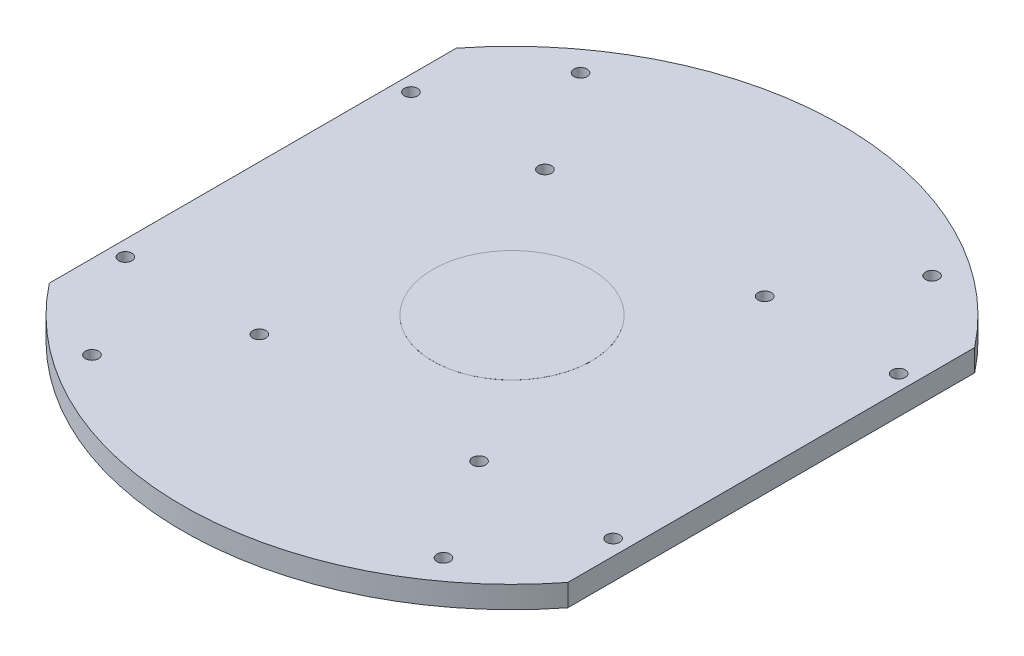
ISO-10303-21;
HEADER;
FILE_DESCRIPTION(('STEP AP214'),'2;1');
FILE_NAME('part.step','',(''),(''),'','','');
FILE_SCHEMA(('AUTOMOTIVE_DESIGN { 1 0 10303 214 1 1 1 1 }'));
ENDSEC;
DATA;
#1=APPLICATION_CONTEXT('core data for automotive mechanical design processes');
#2=APPLICATION_PROTOCOL_DEFINITION('international standard','automotive_design',2000,#1);
#3=PRODUCT_CONTEXT('',#1,'mechanical');
#4=PRODUCT('Part','Part','',(#3));
#5=PRODUCT_RELATED_PRODUCT_CATEGORY('part','',(#4));
#6=PRODUCT_DEFINITION_FORMATION('','',#4);
#7=PRODUCT_DEFINITION_CONTEXT('part definition',#1,'design');
#8=PRODUCT_DEFINITION('design','',#6,#7);
#9=PRODUCT_DEFINITION_SHAPE('','',#8);
#10=(LENGTH_UNIT() NAMED_UNIT(*) SI_UNIT(.MILLI.,.METRE.));
#11=(NAMED_UNIT(*) PLANE_ANGLE_UNIT() SI_UNIT($,.RADIAN.));
#12=(NAMED_UNIT(*) SI_UNIT($,.STERADIAN.) SOLID_ANGLE_UNIT());
#13=UNCERTAINTY_MEASURE_WITH_UNIT(LENGTH_MEASURE(1.E-05),#10,'distance_accuracy_value','');
#14=(GEOMETRIC_REPRESENTATION_CONTEXT(3) GLOBAL_UNCERTAINTY_ASSIGNED_CONTEXT((#13)) GLOBAL_UNIT_ASSIGNED_CONTEXT((#10,
#11,#12)) REPRESENTATION_CONTEXT('',''));
#15=CARTESIAN_POINT('',(0.,0.,0.));
#16=DIRECTION('',(0.,0.,1.));
#17=DIRECTION('',(1.,0.,0.));
#18=AXIS2_PLACEMENT_3D('',#15,#16,#17);
#19=CARTESIAN_POINT('',(0.,5.01,0.));
#20=DIRECTION('',(0.,-1.,0.));
#21=DIRECTION('',(0.,0.,-1.));
#22=AXIS2_PLACEMENT_3D('',#19,#20,#21);
#23=CYLINDRICAL_SURFACE('',#22,18.0557843472479);
#24=CARTESIAN_POINT('',(0.,5.01,0.));
#25=DIRECTION('',(0.,1.,0.));
#26=DIRECTION('',(0.,0.,1.));
#27=AXIS2_PLACEMENT_3D('',#24,#25,#26);
#28=CIRCLE('',#27,18.0557843472479);
#29=CARTESIAN_POINT('',(0.,5.01,-18.0557843472479));
#30=VERTEX_POINT('',#29);
#31=EDGE_CURVE('E11',#30,#30,#28,.T.);
#32=CARTESIAN_POINT('',(0.,5.,0.));
#33=DIRECTION('',(0.,1.,0.));
#34=DIRECTION('',(0.,0.,1.));
#35=AXIS2_PLACEMENT_3D('',#32,#33,#34);
#36=CIRCLE('',#35,18.0557843472479);
#37=CARTESIAN_POINT('',(0.,5.,-18.0557843472479));
#38=VERTEX_POINT('',#37);
#39=EDGE_CURVE('E52',#38,#38,#36,.T.);
#40=CARTESIAN_POINT('',(0.,5.01,-18.0557843472479));
#41=CARTESIAN_POINT('',(0.,5.00989583333333,-18.0557843472479));
#42=CARTESIAN_POINT('',(0.,5.00979166666667,-18.0557843472479));
#43=CARTESIAN_POINT('',(0.,5.00958333333333,-18.0557843472479));
#44=CARTESIAN_POINT('',(0.,5.00947916666667,-18.0557843472479));
#45=CARTESIAN_POINT('',(0.,5.00927083333333,-18.0557843472479));
#46=CARTESIAN_POINT('',(0.,5.00916666666667,-18.0557843472479));
#47=CARTESIAN_POINT('',(0.,5.00895833333333,-18.0557843472479));
#48=CARTESIAN_POINT('',(0.,5.00885416666667,-18.0557843472479));
#49=CARTESIAN_POINT('',(0.,5.00864583333333,-18.0557843472479));
#50=CARTESIAN_POINT('',(0.,5.00854166666667,-18.0557843472479));
#51=CARTESIAN_POINT('',(0.,5.00833333333333,-18.0557843472479));
#52=CARTESIAN_POINT('',(0.,5.00822916666667,-18.0557843472479));
#53=CARTESIAN_POINT('',(0.,5.00802083333333,-18.0557843472479));
#54=CARTESIAN_POINT('',(0.,5.00791666666667,-18.0557843472479));
#55=CARTESIAN_POINT('',(0.,5.00770833333333,-18.0557843472479));
#56=CARTESIAN_POINT('',(0.,5.00760416666667,-18.0557843472479));
#57=CARTESIAN_POINT('',(0.,5.00739583333333,-18.0557843472479));
#58=CARTESIAN_POINT('',(0.,5.00729166666667,-18.0557843472479));
#59=CARTESIAN_POINT('',(0.,5.00708333333333,-18.0557843472479));
#60=CARTESIAN_POINT('',(0.,5.00697916666667,-18.0557843472479));
#61=CARTESIAN_POINT('',(0.,5.00677083333333,-18.0557843472479));
#62=CARTESIAN_POINT('',(0.,5.00666666666667,-18.0557843472479));
#63=CARTESIAN_POINT('',(0.,5.00645833333333,-18.0557843472479));
#64=CARTESIAN_POINT('',(0.,5.00635416666667,-18.0557843472479));
#65=CARTESIAN_POINT('',(0.,5.00614583333333,-18.0557843472479));
#66=CARTESIAN_POINT('',(0.,5.00604166666667,-18.0557843472479));
#67=CARTESIAN_POINT('',(0.,5.00583333333333,-18.0557843472479));
#68=CARTESIAN_POINT('',(0.,5.00572916666667,-18.0557843472479));
#69=CARTESIAN_POINT('',(0.,5.00552083333333,-18.0557843472479));
#70=CARTESIAN_POINT('',(0.,5.00541666666667,-18.0557843472479));
#71=CARTESIAN_POINT('',(0.,5.00520833333333,-18.0557843472479));
#72=CARTESIAN_POINT('',(0.,5.00510416666667,-18.0557843472479));
#73=CARTESIAN_POINT('',(0.,5.00489583333333,-18.0557843472479));
#74=CARTESIAN_POINT('',(0.,5.00479166666667,-18.0557843472479));
#75=CARTESIAN_POINT('',(0.,5.00458333333333,-18.0557843472479));
#76=CARTESIAN_POINT('',(0.,5.00447916666667,-18.0557843472479));
#77=CARTESIAN_POINT('',(0.,5.00427083333333,-18.0557843472479));
#78=CARTESIAN_POINT('',(0.,5.00416666666667,-18.0557843472479));
#79=CARTESIAN_POINT('',(0.,5.00395833333333,-18.0557843472479));
#80=CARTESIAN_POINT('',(0.,5.00385416666667,-18.0557843472479));
#81=CARTESIAN_POINT('',(0.,5.00364583333333,-18.0557843472479));
#82=CARTESIAN_POINT('',(0.,5.00354166666667,-18.0557843472479));
#83=CARTESIAN_POINT('',(0.,5.00333333333333,-18.0557843472479));
#84=CARTESIAN_POINT('',(0.,5.00322916666667,-18.0557843472479));
#85=CARTESIAN_POINT('',(0.,5.00302083333333,-18.0557843472479));
#86=CARTESIAN_POINT('',(0.,5.00291666666667,-18.0557843472479));
#87=CARTESIAN_POINT('',(0.,5.00270833333333,-18.0557843472479));
#88=CARTESIAN_POINT('',(0.,5.00260416666667,-18.0557843472479));
#89=CARTESIAN_POINT('',(0.,5.00239583333333,-18.0557843472479));
#90=CARTESIAN_POINT('',(0.,5.00229166666667,-18.0557843472479));
#91=CARTESIAN_POINT('',(0.,5.00208333333333,-18.0557843472479));
#92=CARTESIAN_POINT('',(0.,5.00197916666667,-18.0557843472479));
#93=CARTESIAN_POINT('',(0.,5.00177083333333,-18.0557843472479));
#94=CARTESIAN_POINT('',(0.,5.00166666666667,-18.0557843472479));
#95=CARTESIAN_POINT('',(0.,5.00145833333333,-18.0557843472479));
#96=CARTESIAN_POINT('',(0.,5.00135416666667,-18.0557843472479));
#97=CARTESIAN_POINT('',(0.,5.00114583333333,-18.0557843472479));
#98=CARTESIAN_POINT('',(0.,5.00104166666667,-18.0557843472479));
#99=CARTESIAN_POINT('',(0.,5.00083333333333,-18.0557843472479));
#100=CARTESIAN_POINT('',(0.,5.00072916666667,-18.0557843472479));
#101=CARTESIAN_POINT('',(0.,5.00052083333333,-18.0557843472479));
#102=CARTESIAN_POINT('',(0.,5.00041666666667,-18.0557843472479));
#103=CARTESIAN_POINT('',(0.,5.00020833333333,-18.0557843472479));
#104=CARTESIAN_POINT('',(0.,5.00010416666667,-18.0557843472479));
#105=CARTESIAN_POINT('',(0.,5.,-18.0557843472479));
#106=B_SPLINE_CURVE_WITH_KNOTS('',3,(#40,#41,#42,#43,#44,#45,#46,#47,#48,#49,#50,#51,#52,#53,
#54,#55,#56,#57,#58,#59,#60,#61,#62,#63,#64,#65,#66,#67,#68,#69,#70,#71,#72,#73,#74,#75,#76,#77,
#78,#79,#80,#81,#82,#83,#84,#85,#86,#87,#88,#89,#90,#91,#92,#93,#94,#95,#96,#97,#98,#99,#100,
#101,#102,#103,#104,#105),.UNSPECIFIED.,.F.,.F.,(4,2,2,2,2,2,2,2,2,2,2,2,2,2,2,2,2,2,2,2,2,2,2,
2,2,2,2,2,2,2,2,2,4),(0.,0.000312499999999445,0.000624999999999758,0.000937499999999203,
0.00124999999999952,0.00156249999999983,0.00187499999999927,0.00218749999999959,
0.00249999999999903,0.00281249999999934,0.00312499999999966,0.0034374999999991,
0.00374999999999941,0.00406249999999973,0.00437499999999917,0.00468749999999948,
0.00499999999999893,0.00531249999999924,0.00562499999999955,0.005937499999999,
0.00624999999999931,0.00656249999999962,0.00687499999999907,0.00718749999999938,
0.00749999999999883,0.00781249999999914,0.00812499999999945,0.0084374999999989,
0.00874999999999921,0.00906249999999952,0.00937499999999897,0.00968749999999928,
0.00999999999999873),.UNSPECIFIED.);
#107=EDGE_CURVE('BSEAM49',#30,#38,#106,.T.);
#108=ORIENTED_EDGE('',*,*,#31,.F.);
#109=ORIENTED_EDGE('',*,*,#39,.T.);
#110=ORIENTED_EDGE('',*,*,#107,.T.);
#111=ORIENTED_EDGE('',*,*,#107,.F.);
#112=EDGE_LOOP('',(#108,#110,#109,#111));
#113=FACE_BOUND('',#112,.T.);
#114=ADVANCED_FACE('F49',(#113),#23,.T.);
#115=CARTESIAN_POINT('',(0.,5.01,0.));
#116=DIRECTION('',(0.,1.,0.));
#117=DIRECTION('',(0.,0.,1.));
#118=AXIS2_PLACEMENT_3D('',#115,#116,#117);
#119=PLANE('',#118);
#120=ORIENTED_EDGE('',*,*,#31,.T.);
#121=EDGE_LOOP('',(#120));
#122=FACE_BOUND('',#121,.T.);
#123=ADVANCED_FACE('F64',(#122),#119,.T.);
#124=CARTESIAN_POINT('',(0.,5.,0.));
#125=DIRECTION('',(0.,1.,0.));
#126=DIRECTION('',(0.,0.,1.));
#127=AXIS2_PLACEMENT_3D('',#124,#125,#126);
#128=PLANE('',#127);
#129=ORIENTED_EDGE('',*,*,#39,.F.);
#130=EDGE_LOOP('',(#129));
#131=FACE_BOUND('',#130,.T.);
#132=ADVANCED_FACE('F62',(#131),#128,.F.);
#133=CLOSED_SHELL('',(#114,#123,#132));
#134=MANIFOLD_SOLID_BREP('B2',#133);
#135=CARTESIAN_POINT('',(0.,5.,0.));
#136=DIRECTION('',(0.,-1.,0.));
#137=DIRECTION('',(0.,0.,-1.));
#138=AXIS2_PLACEMENT_3D('',#135,#136,#137);
#139=CYLINDRICAL_SURFACE('',#138,75.);
#140=CARTESIAN_POINT('',(0.,5.,0.));
#141=DIRECTION('',(0.,1.,0.));
#142=DIRECTION('',(0.,0.,1.));
#143=AXIS2_PLACEMENT_3D('',#140,#141,#142);
#144=CIRCLE('',#143,75.);
#145=CARTESIAN_POINT('',(-59.,5.,46.303347611161));
#146=VERTEX_POINT('',#145);
#147=CARTESIAN_POINT('',(59.,5.,46.303347611161));
#148=VERTEX_POINT('',#147);
#149=EDGE_CURVE('E143',#146,#148,#144,.T.);
#150=ORIENTED_EDGE('',*,*,#149,.F.);
#151=DIRECTION('',(0.,1.,0.));
#152=VECTOR('',#151,1.);
#153=CARTESIAN_POINT('',(-59.,-5.,46.303347611161));
#154=LINE('',#153,#152);
#155=CARTESIAN_POINT('',(-59.,0.,46.303347611161));
#156=VERTEX_POINT('',#155);
#157=EDGE_CURVE('E128',#156,#146,#154,.T.);
#158=ORIENTED_EDGE('',*,*,#157,.F.);
#159=CARTESIAN_POINT('',(0.,0.,0.));
#160=DIRECTION('',(0.,1.,0.));
#161=DIRECTION('',(0.,0.,1.));
#162=AXIS2_PLACEMENT_3D('',#159,#160,#161);
#163=CIRCLE('',#162,75.);
#164=CARTESIAN_POINT('',(59.,0.,46.3033476111609));
#165=VERTEX_POINT('',#164);
#166=EDGE_CURVE('E150',#156,#165,#163,.T.);
#167=ORIENTED_EDGE('',*,*,#166,.T.);
#168=DIRECTION('',(0.,1.,0.));
#169=VECTOR('',#168,1.);
#170=CARTESIAN_POINT('',(59.,-5.,46.303347611161));
#171=LINE('',#170,#169);
#172=EDGE_CURVE('E112',#165,#148,#171,.T.);
#173=ORIENTED_EDGE('',*,*,#172,.T.);
#174=EDGE_LOOP('',(#150,#158,#167,#173));
#175=FACE_BOUND('',#174,.T.);
#176=ADVANCED_FACE('F90',(#175),#139,.T.);
#177=CARTESIAN_POINT('',(59.,0.,-46.3033476111609));
#178=VERTEX_POINT('',#177);
#179=CARTESIAN_POINT('',(-59.,0.,-46.3033476111609));
#180=VERTEX_POINT('',#179);
#181=EDGE_CURVE('E147',#178,#180,#163,.T.);
#182=ORIENTED_EDGE('',*,*,#181,.T.);
#183=DIRECTION('',(0.,1.,0.));
#184=VECTOR('',#183,1.);
#185=CARTESIAN_POINT('',(-59.,-5.,-46.3033476111609));
#186=LINE('',#185,#184);
#187=CARTESIAN_POINT('',(-59.,5.,-46.3033476111609));
#188=VERTEX_POINT('',#187);
#189=EDGE_CURVE('E105',#180,#188,#186,.T.);
#190=ORIENTED_EDGE('',*,*,#189,.T.);
#191=CARTESIAN_POINT('',(59.,5.,-46.3033476111609));
#192=VERTEX_POINT('',#191);
#193=EDGE_CURVE('E145',#192,#188,#144,.T.);
#194=ORIENTED_EDGE('',*,*,#193,.F.);
#195=DIRECTION('',(0.,1.,0.));
#196=VECTOR('',#195,1.);
#197=CARTESIAN_POINT('',(59.,-5.,-46.3033476111609));
#198=LINE('',#197,#196);
#199=EDGE_CURVE('E161',#178,#192,#198,.T.);
#200=ORIENTED_EDGE('',*,*,#199,.F.);
#201=EDGE_LOOP('',(#182,#190,#194,#200));
#202=FACE_BOUND('',#201,.T.);
#203=ADVANCED_FACE('F92',(#202),#139,.T.);
#204=CARTESIAN_POINT('',(0.,5.,0.));
#205=DIRECTION('',(0.,1.,0.));
#206=DIRECTION('',(0.,0.,1.));
#207=AXIS2_PLACEMENT_3D('',#204,#205,#206);
#208=PLANE('',#207);
#209=DIRECTION('',(0.,0.,-1.));
#210=VECTOR('',#209,1.);
#211=CARTESIAN_POINT('',(-59.,5.,-46.3033476111609));
#212=LINE('',#211,#210);
#213=EDGE_CURVE('E131',#146,#188,#212,.T.);
#214=ORIENTED_EDGE('',*,*,#213,.F.);
#215=ORIENTED_EDGE('',*,*,#149,.T.);
#216=DIRECTION('',(0.,0.,1.));
#217=VECTOR('',#216,1.);
#218=CARTESIAN_POINT('',(59.,5.,-46.3033476111609));
#219=LINE('',#218,#217);
#220=EDGE_CURVE('E163',#192,#148,#219,.T.);
#221=ORIENTED_EDGE('',*,*,#220,.F.);
#222=ORIENTED_EDGE('',*,*,#193,.T.);
#223=EDGE_LOOP('',(#214,#215,#221,#222));
#224=FACE_BOUND('',#223,.T.);
#225=CARTESIAN_POINT('',(55.5,5.,32.5));
#226=DIRECTION('',(0.,1.,0.));
#227=DIRECTION('',(0.,0.,-1.));
#228=AXIS2_PLACEMENT_3D('',#225,#226,#227);
#229=CIRCLE('',#228,1.5);
#230=CARTESIAN_POINT('',(55.5,5.,31.));
#231=VERTEX_POINT('',#230);
#232=EDGE_CURVE('E171',#231,#231,#229,.T.);
#233=ORIENTED_EDGE('',*,*,#232,.F.);
#234=EDGE_LOOP('',(#233));
#235=FACE_BOUND('',#234,.T.);
#236=CARTESIAN_POINT('',(-25.,5.,32.5));
#237=DIRECTION('',(0.,1.,0.));
#238=DIRECTION('',(0.,0.,1.));
#239=AXIS2_PLACEMENT_3D('',#236,#237,#238);
#240=CIRCLE('',#239,1.5);
#241=CARTESIAN_POINT('',(-25.,5.,34.));
#242=VERTEX_POINT('',#241);
#243=EDGE_CURVE('E191',#242,#242,#240,.T.);
#244=ORIENTED_EDGE('',*,*,#243,.F.);
#245=EDGE_LOOP('',(#244));
#246=FACE_BOUND('',#245,.T.);
#247=CARTESIAN_POINT('',(-55.5,5.,32.5));
#248=DIRECTION('',(0.,1.,0.));
#249=DIRECTION('',(0.,0.,1.));
#250=AXIS2_PLACEMENT_3D('',#247,#248,#249);
#251=CIRCLE('',#250,1.5);
#252=CARTESIAN_POINT('',(-55.5,5.,34.));
#253=VERTEX_POINT('',#252);
#254=EDGE_CURVE('E190',#253,#253,#251,.T.);
#255=ORIENTED_EDGE('',*,*,#254,.F.);
#256=EDGE_LOOP('',(#255));
#257=FACE_BOUND('',#256,.T.);
#258=CARTESIAN_POINT('',(-25.,5.,-32.5));
#259=DIRECTION('',(0.,1.,0.));
#260=DIRECTION('',(0.,0.,1.));
#261=AXIS2_PLACEMENT_3D('',#258,#259,#260);
#262=CIRCLE('',#261,1.5);
#263=CARTESIAN_POINT('',(-25.,5.,-31.));
#264=VERTEX_POINT('',#263);
#265=EDGE_CURVE('E203',#264,#264,#262,.T.);
#266=ORIENTED_EDGE('',*,*,#265,.F.);
#267=EDGE_LOOP('',(#266));
#268=FACE_BOUND('',#267,.T.);
#269=CARTESIAN_POINT('',(25.,5.,32.5));
#270=DIRECTION('',(0.,1.,0.));
#271=DIRECTION('',(0.,0.,-1.));
#272=AXIS2_PLACEMENT_3D('',#269,#270,#271);
#273=CIRCLE('',#272,1.5);
#274=CARTESIAN_POINT('',(25.,5.,31.));
#275=VERTEX_POINT('',#274);
#276=EDGE_CURVE('E172',#275,#275,#273,.T.);
#277=ORIENTED_EDGE('',*,*,#276,.F.);
#278=EDGE_LOOP('',(#277));
#279=FACE_BOUND('',#278,.T.);
#280=CARTESIAN_POINT('',(25.,5.,-32.5));
#281=DIRECTION('',(0.,1.,0.));
#282=DIRECTION('',(0.,0.,-1.));
#283=AXIS2_PLACEMENT_3D('',#280,#281,#282);
#284=CIRCLE('',#283,1.5);
#285=CARTESIAN_POINT('',(25.,5.,-34.));
#286=VERTEX_POINT('',#285);
#287=EDGE_CURVE('E178',#286,#286,#284,.T.);
#288=ORIENTED_EDGE('',*,*,#287,.F.);
#289=EDGE_LOOP('',(#288));
#290=FACE_BOUND('',#289,.T.);
#291=CARTESIAN_POINT('',(55.5,5.,-32.5));
#292=DIRECTION('',(0.,1.,0.));
#293=DIRECTION('',(0.,0.,-1.));
#294=AXIS2_PLACEMENT_3D('',#291,#292,#293);
#295=CIRCLE('',#294,1.5);
#296=CARTESIAN_POINT('',(55.5,5.,-34.));
#297=VERTEX_POINT('',#296);
#298=EDGE_CURVE('E184',#297,#297,#295,.T.);
#299=ORIENTED_EDGE('',*,*,#298,.F.);
#300=EDGE_LOOP('',(#299));
#301=FACE_BOUND('',#300,.T.);
#302=CARTESIAN_POINT('',(-55.5,5.,-32.5));
#303=DIRECTION('',(0.,1.,0.));
#304=DIRECTION('',(0.,0.,1.));
#305=AXIS2_PLACEMENT_3D('',#302,#303,#304);
#306=CIRCLE('',#305,1.5);
#307=CARTESIAN_POINT('',(-55.5,5.,-31.));
#308=VERTEX_POINT('',#307);
#309=EDGE_CURVE('E202',#308,#308,#306,.T.);
#310=ORIENTED_EDGE('',*,*,#309,.F.);
#311=EDGE_LOOP('',(#310));
#312=FACE_BOUND('',#311,.T.);
#313=CARTESIAN_POINT('',(-40.,5.,55.6));
#314=DIRECTION('',(0.,1.,0.));
#315=DIRECTION('',(0.,0.,-1.));
#316=AXIS2_PLACEMENT_3D('',#313,#314,#315);
#317=CIRCLE('',#316,1.50000000000001);
#318=CARTESIAN_POINT('',(-40.,5.,54.1));
#319=VERTEX_POINT('',#318);
#320=EDGE_CURVE('E214',#319,#319,#317,.T.);
#321=ORIENTED_EDGE('',*,*,#320,.F.);
#322=EDGE_LOOP('',(#321));
#323=FACE_BOUND('',#322,.T.);
#324=CARTESIAN_POINT('',(40.,5.,55.6));
#325=DIRECTION('',(0.,1.,0.));
#326=DIRECTION('',(0.,0.,1.));
#327=AXIS2_PLACEMENT_3D('',#324,#325,#326);
#328=CIRCLE('',#327,1.49999999999992);
#329=CARTESIAN_POINT('',(40.,5.,57.0999999999999));
#330=VERTEX_POINT('',#329);
#331=EDGE_CURVE('E226',#330,#330,#328,.T.);
#332=ORIENTED_EDGE('',*,*,#331,.F.);
#333=EDGE_LOOP('',(#332));
#334=FACE_BOUND('',#333,.T.);
#335=CARTESIAN_POINT('',(40.,5.,-55.6));
#336=DIRECTION('',(0.,1.,0.));
#337=DIRECTION('',(0.,0.,-1.));
#338=AXIS2_PLACEMENT_3D('',#335,#336,#337);
#339=CIRCLE('',#338,1.49999999999992);
#340=CARTESIAN_POINT('',(40.,5.,-57.0999999999999));
#341=VERTEX_POINT('',#340);
#342=EDGE_CURVE('E220',#341,#341,#339,.T.);
#343=ORIENTED_EDGE('',*,*,#342,.F.);
#344=EDGE_LOOP('',(#343));
#345=FACE_BOUND('',#344,.T.);
#346=CARTESIAN_POINT('',(-40.,5.,-55.6));
#347=DIRECTION('',(0.,1.,0.));
#348=DIRECTION('',(0.,0.,1.));
#349=AXIS2_PLACEMENT_3D('',#346,#347,#348);
#350=CIRCLE('',#349,1.5);
#351=CARTESIAN_POINT('',(-40.,5.,-54.1));
#352=VERTEX_POINT('',#351);
#353=EDGE_CURVE('E153',#352,#352,#350,.T.);
#354=ORIENTED_EDGE('',*,*,#353,.F.);
#355=EDGE_LOOP('',(#354));
#356=FACE_BOUND('',#355,.T.);
#357=ADVANCED_FACE('F140',(#224,#235,#246,#257,#268,#279,#290,#301,#312,#323,#334,#345,#356),
#208,.T.);
#358=CARTESIAN_POINT('',(0.,0.,0.));
#359=DIRECTION('',(0.,1.,0.));
#360=DIRECTION('',(0.,0.,1.));
#361=AXIS2_PLACEMENT_3D('',#358,#359,#360);
#362=PLANE('',#361);
#363=CARTESIAN_POINT('',(55.5,0.,32.5));
#364=DIRECTION('',(0.,1.,0.));
#365=DIRECTION('',(0.,0.,-1.));
#366=AXIS2_PLACEMENT_3D('',#363,#364,#365);
#367=CIRCLE('',#366,1.5);
#368=CARTESIAN_POINT('',(55.5,0.,31.));
#369=VERTEX_POINT('',#368);
#370=EDGE_CURVE('E194',#369,#369,#367,.T.);
#371=ORIENTED_EDGE('',*,*,#370,.T.);
#372=EDGE_LOOP('',(#371));
#373=FACE_BOUND('',#372,.T.);
#374=CARTESIAN_POINT('',(-25.,0.,32.5));
#375=DIRECTION('',(0.,1.,0.));
#376=DIRECTION('',(0.,0.,1.));
#377=AXIS2_PLACEMENT_3D('',#374,#375,#376);
#378=CIRCLE('',#377,1.5);
#379=CARTESIAN_POINT('',(-25.,0.,34.));
#380=VERTEX_POINT('',#379);
#381=EDGE_CURVE('E187',#380,#380,#378,.T.);
#382=ORIENTED_EDGE('',*,*,#381,.T.);
#383=EDGE_LOOP('',(#382));
#384=FACE_BOUND('',#383,.T.);
#385=CARTESIAN_POINT('',(-55.5,0.,32.5));
#386=DIRECTION('',(0.,1.,0.));
#387=DIRECTION('',(0.,0.,1.));
#388=AXIS2_PLACEMENT_3D('',#385,#386,#387);
#389=CIRCLE('',#388,1.5);
#390=CARTESIAN_POINT('',(-55.5,0.,34.));
#391=VERTEX_POINT('',#390);
#392=EDGE_CURVE('E206',#391,#391,#389,.T.);
#393=ORIENTED_EDGE('',*,*,#392,.T.);
#394=EDGE_LOOP('',(#393));
#395=FACE_BOUND('',#394,.T.);
#396=CARTESIAN_POINT('',(-25.,0.,-32.5));
#397=DIRECTION('',(0.,1.,0.));
#398=DIRECTION('',(0.,0.,1.));
#399=AXIS2_PLACEMENT_3D('',#396,#397,#398);
#400=CIRCLE('',#399,1.5);
#401=CARTESIAN_POINT('',(-25.,0.,-31.));
#402=VERTEX_POINT('',#401);
#403=EDGE_CURVE('E199',#402,#402,#400,.T.);
#404=ORIENTED_EDGE('',*,*,#403,.T.);
#405=EDGE_LOOP('',(#404));
#406=FACE_BOUND('',#405,.T.);
#407=CARTESIAN_POINT('',(25.,0.,32.5));
#408=DIRECTION('',(0.,1.,0.));
#409=DIRECTION('',(0.,0.,-1.));
#410=AXIS2_PLACEMENT_3D('',#407,#408,#409);
#411=CIRCLE('',#410,1.5);
#412=CARTESIAN_POINT('',(25.,0.,31.));
#413=VERTEX_POINT('',#412);
#414=EDGE_CURVE('E168',#413,#413,#411,.T.);
#415=ORIENTED_EDGE('',*,*,#414,.T.);
#416=EDGE_LOOP('',(#415));
#417=FACE_BOUND('',#416,.T.);
#418=CARTESIAN_POINT('',(25.,0.,-32.5));
#419=DIRECTION('',(0.,1.,0.));
#420=DIRECTION('',(0.,0.,-1.));
#421=AXIS2_PLACEMENT_3D('',#418,#419,#420);
#422=CIRCLE('',#421,1.5);
#423=CARTESIAN_POINT('',(25.,0.,-34.));
#424=VERTEX_POINT('',#423);
#425=EDGE_CURVE('E175',#424,#424,#422,.T.);
#426=ORIENTED_EDGE('',*,*,#425,.T.);
#427=EDGE_LOOP('',(#426));
#428=FACE_BOUND('',#427,.T.);
#429=CARTESIAN_POINT('',(55.5,0.,-32.5));
#430=DIRECTION('',(0.,1.,0.));
#431=DIRECTION('',(0.,0.,-1.));
#432=AXIS2_PLACEMENT_3D('',#429,#430,#431);
#433=CIRCLE('',#432,1.5);
#434=CARTESIAN_POINT('',(55.5,0.,-34.));
#435=VERTEX_POINT('',#434);
#436=EDGE_CURVE('E181',#435,#435,#433,.T.);
#437=ORIENTED_EDGE('',*,*,#436,.T.);
#438=EDGE_LOOP('',(#437));
#439=FACE_BOUND('',#438,.T.);
#440=CARTESIAN_POINT('',(-55.5,0.,-32.5));
#441=DIRECTION('',(0.,1.,0.));
#442=DIRECTION('',(0.,0.,1.));
#443=AXIS2_PLACEMENT_3D('',#440,#441,#442);
#444=CIRCLE('',#443,1.5);
#445=CARTESIAN_POINT('',(-55.5,0.,-31.));
#446=VERTEX_POINT('',#445);
#447=EDGE_CURVE('E211',#446,#446,#444,.T.);
#448=ORIENTED_EDGE('',*,*,#447,.T.);
#449=EDGE_LOOP('',(#448));
#450=FACE_BOUND('',#449,.T.);
#451=CARTESIAN_POINT('',(-40.,0.,55.6));
#452=DIRECTION('',(0.,1.,0.));
#453=DIRECTION('',(0.,0.,-1.));
#454=AXIS2_PLACEMENT_3D('',#451,#452,#453);
#455=CIRCLE('',#454,1.50000000000001);
#456=CARTESIAN_POINT('',(-40.,0.,54.1));
#457=VERTEX_POINT('',#456);
#458=EDGE_CURVE('E229',#457,#457,#455,.T.);
#459=ORIENTED_EDGE('',*,*,#458,.T.);
#460=EDGE_LOOP('',(#459));
#461=FACE_BOUND('',#460,.T.);
#462=CARTESIAN_POINT('',(40.,0.,55.6));
#463=DIRECTION('',(0.,1.,0.));
#464=DIRECTION('',(0.,0.,1.));
#465=AXIS2_PLACEMENT_3D('',#462,#463,#464);
#466=CIRCLE('',#465,1.49999999999992);
#467=CARTESIAN_POINT('',(40.,0.,57.0999999999999));
#468=VERTEX_POINT('',#467);
#469=EDGE_CURVE('E223',#468,#468,#466,.T.);
#470=ORIENTED_EDGE('',*,*,#469,.T.);
#471=EDGE_LOOP('',(#470));
#472=FACE_BOUND('',#471,.T.);
#473=CARTESIAN_POINT('',(40.,0.,-55.6));
#474=DIRECTION('',(0.,1.,0.));
#475=DIRECTION('',(0.,0.,-1.));
#476=AXIS2_PLACEMENT_3D('',#473,#474,#475);
#477=CIRCLE('',#476,1.49999999999992);
#478=CARTESIAN_POINT('',(40.,0.,-57.0999999999999));
#479=VERTEX_POINT('',#478);
#480=EDGE_CURVE('E217',#479,#479,#477,.T.);
#481=ORIENTED_EDGE('',*,*,#480,.T.);
#482=EDGE_LOOP('',(#481));
#483=FACE_BOUND('',#482,.T.);
#484=CARTESIAN_POINT('',(-40.,0.,-55.6));
#485=DIRECTION('',(0.,1.,0.));
#486=DIRECTION('',(0.,0.,1.));
#487=AXIS2_PLACEMENT_3D('',#484,#485,#486);
#488=CIRCLE('',#487,1.5);
#489=CARTESIAN_POINT('',(-40.,0.,-54.1));
#490=VERTEX_POINT('',#489);
#491=EDGE_CURVE('E155',#490,#490,#488,.T.);
#492=ORIENTED_EDGE('',*,*,#491,.T.);
#493=EDGE_LOOP('',(#492));
#494=FACE_BOUND('',#493,.T.);
#495=ORIENTED_EDGE('',*,*,#166,.F.);
#496=DIRECTION('',(0.,0.,-1.));
#497=VECTOR('',#496,1.);
#498=CARTESIAN_POINT('',(-59.,0.,0.));
#499=LINE('',#498,#497);
#500=EDGE_CURVE('E47',#156,#180,#499,.T.);
#501=ORIENTED_EDGE('',*,*,#500,.T.);
#502=ORIENTED_EDGE('',*,*,#181,.F.);
#503=DIRECTION('',(0.,0.,1.));
#504=VECTOR('',#503,1.);
#505=CARTESIAN_POINT('',(59.,0.,0.));
#506=LINE('',#505,#504);
#507=EDGE_CURVE('E98',#178,#165,#506,.T.);
#508=ORIENTED_EDGE('',*,*,#507,.T.);
#509=EDGE_LOOP('',(#495,#501,#502,#508));
#510=FACE_BOUND('',#509,.T.);
#511=ADVANCED_FACE('F158',(#373,#384,#395,#406,#417,#428,#439,#450,#461,#472,#483,#494,#510),
#362,.F.);
#512=CARTESIAN_POINT('',(-40.,0.,-55.6));
#513=DIRECTION('',(0.,1.,0.));
#514=DIRECTION('',(0.,0.,1.));
#515=AXIS2_PLACEMENT_3D('',#512,#513,#514);
#516=CYLINDRICAL_SURFACE('',#515,1.5);
#517=ORIENTED_EDGE('',*,*,#491,.F.);
#518=EDGE_LOOP('',(#517));
#519=FACE_BOUND('',#518,.T.);
#520=ORIENTED_EDGE('',*,*,#353,.T.);
#521=EDGE_LOOP('',(#520));
#522=FACE_BOUND('',#521,.T.);
#523=ADVANCED_FACE('F239',(#519,#522),#516,.F.);
#524=CARTESIAN_POINT('',(40.,0.,-55.6));
#525=DIRECTION('',(0.,1.,0.));
#526=DIRECTION('',(0.,0.,1.));
#527=AXIS2_PLACEMENT_3D('',#524,#525,#526);
#528=CYLINDRICAL_SURFACE('',#527,1.49999999999992);
#529=ORIENTED_EDGE('',*,*,#480,.F.);
#530=EDGE_LOOP('',(#529));
#531=FACE_BOUND('',#530,.T.);
#532=ORIENTED_EDGE('',*,*,#342,.T.);
#533=EDGE_LOOP('',(#532));
#534=FACE_BOUND('',#533,.T.);
#535=ADVANCED_FACE('F323',(#531,#534),#528,.F.);
#536=CARTESIAN_POINT('',(40.,0.,55.6));
#537=DIRECTION('',(0.,1.,0.));
#538=DIRECTION('',(0.,0.,1.));
#539=AXIS2_PLACEMENT_3D('',#536,#537,#538);
#540=CYLINDRICAL_SURFACE('',#539,1.49999999999992);
#541=ORIENTED_EDGE('',*,*,#469,.F.);
#542=EDGE_LOOP('',(#541));
#543=FACE_BOUND('',#542,.T.);
#544=ORIENTED_EDGE('',*,*,#331,.T.);
#545=EDGE_LOOP('',(#544));
#546=FACE_BOUND('',#545,.T.);
#547=ADVANCED_FACE('F326',(#543,#546),#540,.F.);
#548=CARTESIAN_POINT('',(-40.,0.,55.6));
#549=DIRECTION('',(0.,1.,0.));
#550=DIRECTION('',(0.,0.,1.));
#551=AXIS2_PLACEMENT_3D('',#548,#549,#550);
#552=CYLINDRICAL_SURFACE('',#551,1.50000000000001);
#553=ORIENTED_EDGE('',*,*,#458,.F.);
#554=EDGE_LOOP('',(#553));
#555=FACE_BOUND('',#554,.T.);
#556=ORIENTED_EDGE('',*,*,#320,.T.);
#557=EDGE_LOOP('',(#556));
#558=FACE_BOUND('',#557,.T.);
#559=ADVANCED_FACE('F321',(#555,#558),#552,.F.);
#560=CARTESIAN_POINT('',(-55.5,0.,-32.5));
#561=DIRECTION('',(0.,1.,0.));
#562=DIRECTION('',(0.,0.,1.));
#563=AXIS2_PLACEMENT_3D('',#560,#561,#562);
#564=CYLINDRICAL_SURFACE('',#563,1.5);
#565=ORIENTED_EDGE('',*,*,#447,.F.);
#566=EDGE_LOOP('',(#565));
#567=FACE_BOUND('',#566,.T.);
#568=ORIENTED_EDGE('',*,*,#309,.T.);
#569=EDGE_LOOP('',(#568));
#570=FACE_BOUND('',#569,.T.);
#571=ADVANCED_FACE('F304',(#567,#570),#564,.F.);
#572=CARTESIAN_POINT('',(55.5,0.,-32.5));
#573=DIRECTION('',(0.,1.,0.));
#574=DIRECTION('',(0.,0.,1.));
#575=AXIS2_PLACEMENT_3D('',#572,#573,#574);
#576=CYLINDRICAL_SURFACE('',#575,1.5);
#577=ORIENTED_EDGE('',*,*,#436,.F.);
#578=EDGE_LOOP('',(#577));
#579=FACE_BOUND('',#578,.T.);
#580=ORIENTED_EDGE('',*,*,#298,.T.);
#581=EDGE_LOOP('',(#580));
#582=FACE_BOUND('',#581,.T.);
#583=ADVANCED_FACE('F300',(#579,#582),#576,.F.);
#584=CARTESIAN_POINT('',(25.,0.,-32.5));
#585=DIRECTION('',(0.,1.,0.));
#586=DIRECTION('',(0.,0.,1.));
#587=AXIS2_PLACEMENT_3D('',#584,#585,#586);
#588=CYLINDRICAL_SURFACE('',#587,1.5);
#589=ORIENTED_EDGE('',*,*,#425,.F.);
#590=EDGE_LOOP('',(#589));
#591=FACE_BOUND('',#590,.T.);
#592=ORIENTED_EDGE('',*,*,#287,.T.);
#593=EDGE_LOOP('',(#592));
#594=FACE_BOUND('',#593,.T.);
#595=ADVANCED_FACE('F296',(#591,#594),#588,.F.);
#596=CARTESIAN_POINT('',(25.,0.,32.5));
#597=DIRECTION('',(0.,1.,0.));
#598=DIRECTION('',(0.,0.,1.));
#599=AXIS2_PLACEMENT_3D('',#596,#597,#598);
#600=CYLINDRICAL_SURFACE('',#599,1.5);
#601=ORIENTED_EDGE('',*,*,#414,.F.);
#602=EDGE_LOOP('',(#601));
#603=FACE_BOUND('',#602,.T.);
#604=ORIENTED_EDGE('',*,*,#276,.T.);
#605=EDGE_LOOP('',(#604));
#606=FACE_BOUND('',#605,.T.);
#607=ADVANCED_FACE('F292',(#603,#606),#600,.F.);
#608=CARTESIAN_POINT('',(-25.,0.,-32.5));
#609=DIRECTION('',(0.,1.,0.));
#610=DIRECTION('',(0.,0.,1.));
#611=AXIS2_PLACEMENT_3D('',#608,#609,#610);
#612=CYLINDRICAL_SURFACE('',#611,1.5);
#613=ORIENTED_EDGE('',*,*,#403,.F.);
#614=EDGE_LOOP('',(#613));
#615=FACE_BOUND('',#614,.T.);
#616=ORIENTED_EDGE('',*,*,#265,.T.);
#617=EDGE_LOOP('',(#616));
#618=FACE_BOUND('',#617,.T.);
#619=ADVANCED_FACE('F295',(#615,#618),#612,.F.);
#620=CARTESIAN_POINT('',(-55.5,0.,32.5));
#621=DIRECTION('',(0.,1.,0.));
#622=DIRECTION('',(0.,0.,1.));
#623=AXIS2_PLACEMENT_3D('',#620,#621,#622);
#624=CYLINDRICAL_SURFACE('',#623,1.5);
#625=ORIENTED_EDGE('',*,*,#392,.F.);
#626=EDGE_LOOP('',(#625));
#627=FACE_BOUND('',#626,.T.);
#628=ORIENTED_EDGE('',*,*,#254,.T.);
#629=EDGE_LOOP('',(#628));
#630=FACE_BOUND('',#629,.T.);
#631=ADVANCED_FACE('F309',(#627,#630),#624,.F.);
#632=CARTESIAN_POINT('',(-25.,0.,32.5));
#633=DIRECTION('',(0.,1.,0.));
#634=DIRECTION('',(0.,0.,1.));
#635=AXIS2_PLACEMENT_3D('',#632,#633,#634);
#636=CYLINDRICAL_SURFACE('',#635,1.5);
#637=ORIENTED_EDGE('',*,*,#381,.F.);
#638=EDGE_LOOP('',(#637));
#639=FACE_BOUND('',#638,.T.);
#640=ORIENTED_EDGE('',*,*,#243,.T.);
#641=EDGE_LOOP('',(#640));
#642=FACE_BOUND('',#641,.T.);
#643=ADVANCED_FACE('F306',(#639,#642),#636,.F.);
#644=CARTESIAN_POINT('',(55.5,0.,32.5));
#645=DIRECTION('',(0.,1.,0.));
#646=DIRECTION('',(0.,0.,1.));
#647=AXIS2_PLACEMENT_3D('',#644,#645,#646);
#648=CYLINDRICAL_SURFACE('',#647,1.5);
#649=ORIENTED_EDGE('',*,*,#370,.F.);
#650=EDGE_LOOP('',(#649));
#651=FACE_BOUND('',#650,.T.);
#652=ORIENTED_EDGE('',*,*,#232,.T.);
#653=EDGE_LOOP('',(#652));
#654=FACE_BOUND('',#653,.T.);
#655=ADVANCED_FACE('F278',(#651,#654),#648,.F.);
#656=CARTESIAN_POINT('',(59.,-5.,-46.3033476111609));
#657=DIRECTION('',(-1.,0.,0.));
#658=DIRECTION('',(0.,0.,1.));
#659=AXIS2_PLACEMENT_3D('',#656,#657,#658);
#660=PLANE('',#659);
#661=ORIENTED_EDGE('',*,*,#199,.T.);
#662=ORIENTED_EDGE('',*,*,#220,.T.);
#663=ORIENTED_EDGE('',*,*,#172,.F.);
#664=ORIENTED_EDGE('',*,*,#507,.F.);
#665=EDGE_LOOP('',(#661,#662,#663,#664));
#666=FACE_BOUND('',#665,.T.);
#667=ADVANCED_FACE('F160',(#666),#660,.F.);
#668=CARTESIAN_POINT('',(-59.,-5.,-46.3033476111609));
#669=DIRECTION('',(1.,0.,0.));
#670=DIRECTION('',(0.,0.,-1.));
#671=AXIS2_PLACEMENT_3D('',#668,#669,#670);
#672=PLANE('',#671);
#673=ORIENTED_EDGE('',*,*,#157,.T.);
#674=ORIENTED_EDGE('',*,*,#213,.T.);
#675=ORIENTED_EDGE('',*,*,#189,.F.);
#676=ORIENTED_EDGE('',*,*,#500,.F.);
#677=EDGE_LOOP('',(#673,#674,#675,#676));
#678=FACE_BOUND('',#677,.T.);
#679=ADVANCED_FACE('F130',(#678),#672,.F.);
#680=CLOSED_SHELL('',(#176,#203,#357,#511,#523,#535,#547,#559,#571,#583,#595,#607,#619,#631,
#643,#655,#667,#679));
#681=MANIFOLD_SOLID_BREP('B6',#680);
#682=ADVANCED_BREP_SHAPE_REPRESENTATION('',(#18,#134,#681),#14);
#683=SHAPE_DEFINITION_REPRESENTATION(#9,#682);
ENDSEC;
END-ISO-10303-21;
